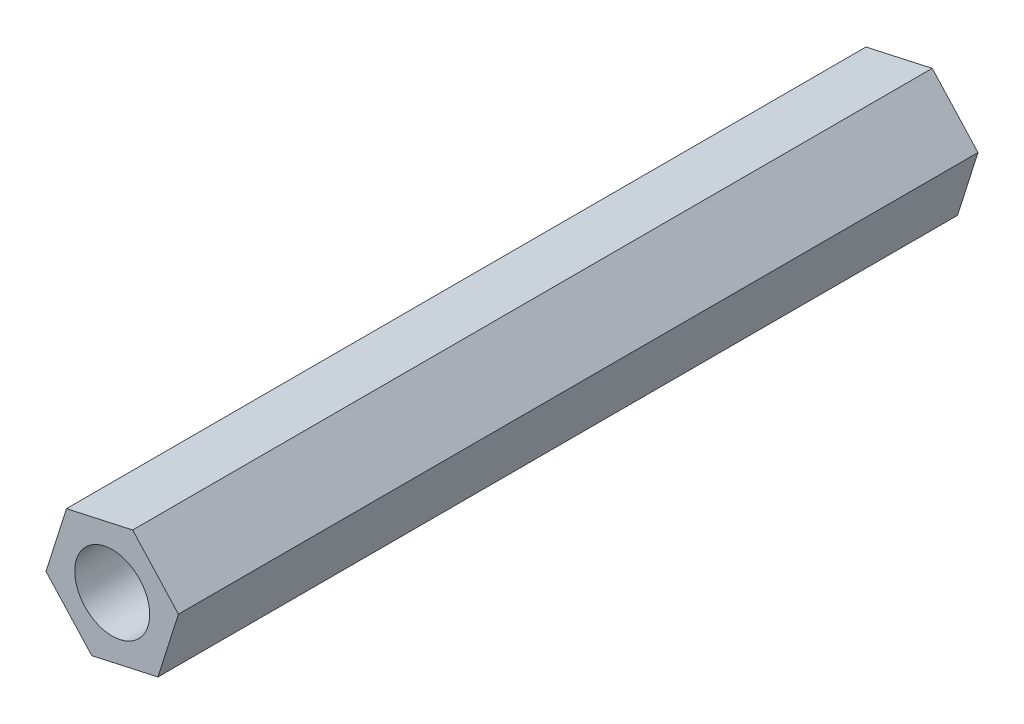
ISO-10303-21;
HEADER;
FILE_DESCRIPTION(('STEP AP214'),'2;1');
FILE_NAME('part.step','',(''),(''),'','','');
FILE_SCHEMA(('AUTOMOTIVE_DESIGN { 1 0 10303 214 1 1 1 1 }'));
ENDSEC;
DATA;
#1=APPLICATION_CONTEXT('core data for automotive mechanical design processes');
#2=APPLICATION_PROTOCOL_DEFINITION('international standard','automotive_design',2000,#1);
#3=PRODUCT_CONTEXT('',#1,'mechanical');
#4=PRODUCT('Part','Part','',(#3));
#5=PRODUCT_RELATED_PRODUCT_CATEGORY('part','',(#4));
#6=PRODUCT_DEFINITION_FORMATION('','',#4);
#7=PRODUCT_DEFINITION_CONTEXT('part definition',#1,'design');
#8=PRODUCT_DEFINITION('design','',#6,#7);
#9=PRODUCT_DEFINITION_SHAPE('','',#8);
#10=(LENGTH_UNIT() NAMED_UNIT(*) SI_UNIT(.MILLI.,.METRE.));
#11=(NAMED_UNIT(*) PLANE_ANGLE_UNIT() SI_UNIT($,.RADIAN.));
#12=(NAMED_UNIT(*) SI_UNIT($,.STERADIAN.) SOLID_ANGLE_UNIT());
#13=UNCERTAINTY_MEASURE_WITH_UNIT(LENGTH_MEASURE(1.E-05),#10,'distance_accuracy_value','');
#14=(GEOMETRIC_REPRESENTATION_CONTEXT(3) GLOBAL_UNCERTAINTY_ASSIGNED_CONTEXT((#13)) GLOBAL_UNIT_ASSIGNED_CONTEXT((#10,
#11,#12)) REPRESENTATION_CONTEXT('',''));
#15=CARTESIAN_POINT('',(0.,0.,0.));
#16=DIRECTION('',(0.,0.,1.));
#17=DIRECTION('',(1.,0.,0.));
#18=AXIS2_PLACEMENT_3D('',#15,#16,#17);
#19=CARTESIAN_POINT('',(0.,0.,32.));
#20=DIRECTION('',(0.,0.,1.));
#21=DIRECTION('',(1.,0.,0.));
#22=AXIS2_PLACEMENT_3D('',#19,#20,#21);
#23=PLANE('',#22);
#24=DIRECTION('',(0.301648882780597,0.953419084934436,0.));
#25=VECTOR('',#24,1.);
#26=CARTESIAN_POINT('',(1.83126574996171,-2.00244827307736,32.));
#27=LINE('',#26,#25);
#28=CARTESIAN_POINT('',(1.83126574996171,-2.00244827307736,32.));
#29=VERTEX_POINT('',#28);
#30=CARTESIAN_POINT('',(2.64980394923012,0.584698524008543,32.));
#31=VERTEX_POINT('',#30);
#32=EDGE_CURVE('E146',#29,#31,#27,.T.);
#33=ORIENTED_EDGE('',*,*,#32,.T.);
#34=DIRECTION('',(-0.674860706615837,0.737945137978409,0.));
#35=VECTOR('',#34,1.);
#36=CARTESIAN_POINT('',(2.64980394923012,0.584698524008543,32.));
#37=LINE('',#36,#35);
#38=CARTESIAN_POINT('',(0.818538199268401,2.58714679708588,32.));
#39=VERTEX_POINT('',#38);
#40=EDGE_CURVE('E94',#31,#39,#37,.T.);
#41=ORIENTED_EDGE('',*,*,#40,.T.);
#42=DIRECTION('',(-0.976509589396434,-0.215473946956026,0.));
#43=VECTOR('',#42,1.);
#44=CARTESIAN_POINT('',(0.818538199268401,2.58714679708588,32.));
#45=LINE('',#44,#43);
#46=CARTESIAN_POINT('',(-1.8312657499617,2.00244827307734,32.));
#47=VERTEX_POINT('',#46);
#48=EDGE_CURVE('E107',#39,#47,#45,.T.);
#49=ORIENTED_EDGE('',*,*,#48,.T.);
#50=DIRECTION('',(-0.301648882780597,-0.953419084934436,0.));
#51=VECTOR('',#50,1.);
#52=CARTESIAN_POINT('',(-1.8312657499617,2.00244827307734,32.));
#53=LINE('',#52,#51);
#54=CARTESIAN_POINT('',(-2.6498039492301,-0.584698524008529,32.));
#55=VERTEX_POINT('',#54);
#56=EDGE_CURVE('E101',#47,#55,#53,.T.);
#57=ORIENTED_EDGE('',*,*,#56,.T.);
#58=DIRECTION('',(0.674860706615837,-0.737945137978409,0.));
#59=VECTOR('',#58,1.);
#60=CARTESIAN_POINT('',(-2.6498039492301,-0.584698524008529,32.));
#61=LINE('',#60,#59);
#62=CARTESIAN_POINT('',(-0.818538199268357,-2.58714679708589,32.));
#63=VERTEX_POINT('',#62);
#64=EDGE_CURVE('E105',#55,#63,#61,.T.);
#65=ORIENTED_EDGE('',*,*,#64,.T.);
#66=DIRECTION('',(0.976509589396434,0.215473946956027,0.));
#67=VECTOR('',#66,1.);
#68=CARTESIAN_POINT('',(-0.818538199268357,-2.58714679708589,32.));
#69=LINE('',#68,#67);
#70=EDGE_CURVE('E57',#63,#29,#69,.T.);
#71=ORIENTED_EDGE('',*,*,#70,.T.);
#72=EDGE_LOOP('',(#33,#41,#49,#57,#65,#71));
#73=FACE_BOUND('',#72,.T.);
#74=CARTESIAN_POINT('',(0.,0.,32.));
#75=DIRECTION('',(0.,0.,1.));
#76=DIRECTION('',(1.,0.,0.));
#77=AXIS2_PLACEMENT_3D('',#74,#75,#76);
#78=CIRCLE('',#77,1.5);
#79=CARTESIAN_POINT('',(1.5,0.,32.));
#80=VERTEX_POINT('',#79);
#81=EDGE_CURVE('E134',#80,#80,#78,.T.);
#82=ORIENTED_EDGE('',*,*,#81,.F.);
#83=EDGE_LOOP('',(#82));
#84=FACE_BOUND('',#83,.T.);
#85=ADVANCED_FACE('F39',(#73,#84),#23,.T.);
#86=CARTESIAN_POINT('',(0.,0.,0.));
#87=DIRECTION('',(0.,0.,1.));
#88=DIRECTION('',(1.,0.,0.));
#89=AXIS2_PLACEMENT_3D('',#86,#87,#88);
#90=PLANE('',#89);
#91=DIRECTION('',(0.301648882780597,0.953419084934436,0.));
#92=VECTOR('',#91,1.);
#93=CARTESIAN_POINT('',(1.83126574996171,-2.00244827307736,0.));
#94=LINE('',#93,#92);
#95=CARTESIAN_POINT('',(1.83126574996171,-2.00244827307736,0.));
#96=VERTEX_POINT('',#95);
#97=CARTESIAN_POINT('',(2.64980394923012,0.584698524008543,0.));
#98=VERTEX_POINT('',#97);
#99=EDGE_CURVE('E129',#96,#98,#94,.T.);
#100=ORIENTED_EDGE('',*,*,#99,.F.);
#101=DIRECTION('',(0.976509589396434,0.215473946956027,0.));
#102=VECTOR('',#101,1.);
#103=CARTESIAN_POINT('',(-0.818538199268357,-2.58714679708589,0.));
#104=LINE('',#103,#102);
#105=CARTESIAN_POINT('',(-0.818538199268357,-2.58714679708589,0.));
#106=VERTEX_POINT('',#105);
#107=EDGE_CURVE('E86',#106,#96,#104,.T.);
#108=ORIENTED_EDGE('',*,*,#107,.F.);
#109=DIRECTION('',(0.674860706615837,-0.737945137978409,0.));
#110=VECTOR('',#109,1.);
#111=CARTESIAN_POINT('',(-2.6498039492301,-0.584698524008529,0.));
#112=LINE('',#111,#110);
#113=CARTESIAN_POINT('',(-2.6498039492301,-0.584698524008529,0.));
#114=VERTEX_POINT('',#113);
#115=EDGE_CURVE('E80',#114,#106,#112,.T.);
#116=ORIENTED_EDGE('',*,*,#115,.F.);
#117=DIRECTION('',(-0.301648882780597,-0.953419084934436,0.));
#118=VECTOR('',#117,1.);
#119=CARTESIAN_POINT('',(-1.8312657499617,2.00244827307734,0.));
#120=LINE('',#119,#118);
#121=CARTESIAN_POINT('',(-1.8312657499617,2.00244827307734,0.));
#122=VERTEX_POINT('',#121);
#123=EDGE_CURVE('E116',#122,#114,#120,.T.);
#124=ORIENTED_EDGE('',*,*,#123,.F.);
#125=DIRECTION('',(-0.976509589396434,-0.215473946956026,0.));
#126=VECTOR('',#125,1.);
#127=CARTESIAN_POINT('',(0.818538199268401,2.58714679708588,0.));
#128=LINE('',#127,#126);
#129=CARTESIAN_POINT('',(0.818538199268401,2.58714679708588,0.));
#130=VERTEX_POINT('',#129);
#131=EDGE_CURVE('E137',#130,#122,#128,.T.);
#132=ORIENTED_EDGE('',*,*,#131,.F.);
#133=DIRECTION('',(-0.674860706615837,0.737945137978409,0.));
#134=VECTOR('',#133,1.);
#135=CARTESIAN_POINT('',(2.64980394923012,0.584698524008543,0.));
#136=LINE('',#135,#134);
#137=EDGE_CURVE('E133',#98,#130,#136,.T.);
#138=ORIENTED_EDGE('',*,*,#137,.F.);
#139=EDGE_LOOP('',(#100,#108,#116,#124,#132,#138));
#140=FACE_BOUND('',#139,.T.);
#141=CARTESIAN_POINT('',(0.,0.,0.));
#142=DIRECTION('',(0.,0.,1.));
#143=DIRECTION('',(1.,0.,0.));
#144=AXIS2_PLACEMENT_3D('',#141,#142,#143);
#145=CIRCLE('',#144,1.5);
#146=CARTESIAN_POINT('',(1.5,0.,0.));
#147=VERTEX_POINT('',#146);
#148=EDGE_CURVE('E243',#147,#147,#145,.T.);
#149=ORIENTED_EDGE('',*,*,#148,.T.);
#150=EDGE_LOOP('',(#149));
#151=FACE_BOUND('',#150,.T.);
#152=ADVANCED_FACE('F159',(#140,#151),#90,.F.);
#153=CARTESIAN_POINT('',(1.83126574996171,-2.00244827307736,32.));
#154=DIRECTION('',(-0.953419084934436,0.301648882780597,0.));
#155=DIRECTION('',(-0.301648882780597,-0.953419084934436,0.));
#156=AXIS2_PLACEMENT_3D('',#153,#154,#155);
#157=PLANE('',#156);
#158=ORIENTED_EDGE('',*,*,#99,.T.);
#159=DIRECTION('',(0.,0.,-1.));
#160=VECTOR('',#159,1.);
#161=CARTESIAN_POINT('',(2.64980394923012,0.584698524008543,32.));
#162=LINE('',#161,#160);
#163=EDGE_CURVE('E11',#31,#98,#162,.T.);
#164=ORIENTED_EDGE('',*,*,#163,.F.);
#165=ORIENTED_EDGE('',*,*,#32,.F.);
#166=DIRECTION('',(0.,0.,-1.));
#167=VECTOR('',#166,1.);
#168=CARTESIAN_POINT('',(1.83126574996171,-2.00244827307736,32.));
#169=LINE('',#168,#167);
#170=EDGE_CURVE('E125',#29,#96,#169,.T.);
#171=ORIENTED_EDGE('',*,*,#170,.T.);
#172=EDGE_LOOP('',(#158,#164,#165,#171));
#173=FACE_BOUND('',#172,.T.);
#174=ADVANCED_FACE('F41',(#173),#157,.F.);
#175=CARTESIAN_POINT('',(2.64980394923012,0.584698524008543,32.));
#176=DIRECTION('',(-0.737945137978409,-0.674860706615837,0.));
#177=DIRECTION('',(0.674860706615837,-0.737945137978409,0.));
#178=AXIS2_PLACEMENT_3D('',#175,#176,#177);
#179=PLANE('',#178);
#180=ORIENTED_EDGE('',*,*,#137,.T.);
#181=DIRECTION('',(0.,0.,-1.));
#182=VECTOR('',#181,1.);
#183=CARTESIAN_POINT('',(0.818538199268401,2.58714679708588,32.));
#184=LINE('',#183,#182);
#185=EDGE_CURVE('E49',#39,#130,#184,.T.);
#186=ORIENTED_EDGE('',*,*,#185,.F.);
#187=ORIENTED_EDGE('',*,*,#40,.F.);
#188=ORIENTED_EDGE('',*,*,#163,.T.);
#189=EDGE_LOOP('',(#180,#186,#187,#188));
#190=FACE_BOUND('',#189,.T.);
#191=ADVANCED_FACE('F184',(#190),#179,.F.);
#192=CARTESIAN_POINT('',(0.818538199268401,2.58714679708588,32.));
#193=DIRECTION('',(0.215473946956026,-0.976509589396434,0.));
#194=DIRECTION('',(0.976509589396434,0.215473946956026,0.));
#195=AXIS2_PLACEMENT_3D('',#192,#193,#194);
#196=PLANE('',#195);
#197=ORIENTED_EDGE('',*,*,#131,.T.);
#198=DIRECTION('',(0.,0.,-1.));
#199=VECTOR('',#198,1.);
#200=CARTESIAN_POINT('',(-1.8312657499617,2.00244827307734,32.));
#201=LINE('',#200,#199);
#202=EDGE_CURVE('E118',#47,#122,#201,.T.);
#203=ORIENTED_EDGE('',*,*,#202,.F.);
#204=ORIENTED_EDGE('',*,*,#48,.F.);
#205=ORIENTED_EDGE('',*,*,#185,.T.);
#206=EDGE_LOOP('',(#197,#203,#204,#205));
#207=FACE_BOUND('',#206,.T.);
#208=ADVANCED_FACE('F156',(#207),#196,.F.);
#209=CARTESIAN_POINT('',(-1.8312657499617,2.00244827307734,32.));
#210=DIRECTION('',(0.953419084934436,-0.301648882780597,0.));
#211=DIRECTION('',(0.301648882780597,0.953419084934436,0.));
#212=AXIS2_PLACEMENT_3D('',#209,#210,#211);
#213=PLANE('',#212);
#214=ORIENTED_EDGE('',*,*,#123,.T.);
#215=DIRECTION('',(0.,0.,-1.));
#216=VECTOR('',#215,1.);
#217=CARTESIAN_POINT('',(-2.6498039492301,-0.584698524008529,32.));
#218=LINE('',#217,#216);
#219=EDGE_CURVE('E113',#55,#114,#218,.T.);
#220=ORIENTED_EDGE('',*,*,#219,.F.);
#221=ORIENTED_EDGE('',*,*,#56,.F.);
#222=ORIENTED_EDGE('',*,*,#202,.T.);
#223=EDGE_LOOP('',(#214,#220,#221,#222));
#224=FACE_BOUND('',#223,.T.);
#225=ADVANCED_FACE('F114',(#224),#213,.F.);
#226=CARTESIAN_POINT('',(-2.6498039492301,-0.584698524008529,32.));
#227=DIRECTION('',(0.737945137978409,0.674860706615837,0.));
#228=DIRECTION('',(-0.674860706615837,0.737945137978409,0.));
#229=AXIS2_PLACEMENT_3D('',#226,#227,#228);
#230=PLANE('',#229);
#231=ORIENTED_EDGE('',*,*,#115,.T.);
#232=DIRECTION('',(0.,0.,-1.));
#233=VECTOR('',#232,1.);
#234=CARTESIAN_POINT('',(-0.818538199268357,-2.58714679708589,32.));
#235=LINE('',#234,#233);
#236=EDGE_CURVE('E119',#63,#106,#235,.T.);
#237=ORIENTED_EDGE('',*,*,#236,.F.);
#238=ORIENTED_EDGE('',*,*,#64,.F.);
#239=ORIENTED_EDGE('',*,*,#219,.T.);
#240=EDGE_LOOP('',(#231,#237,#238,#239));
#241=FACE_BOUND('',#240,.T.);
#242=ADVANCED_FACE('F121',(#241),#230,.F.);
#243=CARTESIAN_POINT('',(-0.818538199268357,-2.58714679708589,32.));
#244=DIRECTION('',(-0.215473946956027,0.976509589396434,0.));
#245=DIRECTION('',(-0.976509589396434,-0.215473946956027,0.));
#246=AXIS2_PLACEMENT_3D('',#243,#244,#245);
#247=PLANE('',#246);
#248=ORIENTED_EDGE('',*,*,#107,.T.);
#249=ORIENTED_EDGE('',*,*,#170,.F.);
#250=ORIENTED_EDGE('',*,*,#70,.F.);
#251=ORIENTED_EDGE('',*,*,#236,.T.);
#252=EDGE_LOOP('',(#248,#249,#250,#251));
#253=FACE_BOUND('',#252,.T.);
#254=ADVANCED_FACE('F164',(#253),#247,.F.);
#255=CARTESIAN_POINT('',(0.,0.,32.));
#256=DIRECTION('',(0.,0.,-1.));
#257=DIRECTION('',(-1.,0.,0.));
#258=AXIS2_PLACEMENT_3D('',#255,#256,#257);
#259=CYLINDRICAL_SURFACE('',#258,1.5);
#260=ORIENTED_EDGE('',*,*,#81,.T.);
#261=EDGE_LOOP('',(#260));
#262=FACE_BOUND('',#261,.T.);
#263=ORIENTED_EDGE('',*,*,#148,.F.);
#264=EDGE_LOOP('',(#263));
#265=FACE_BOUND('',#264,.T.);
#266=ADVANCED_FACE('F166',(#262,#265),#259,.F.);
#267=CLOSED_SHELL('',(#85,#152,#174,#191,#208,#225,#242,#254,#266));
#268=MANIFOLD_SOLID_BREP('B2',#267);
#269=ADVANCED_BREP_SHAPE_REPRESENTATION('',(#18,#268),#14);
#270=SHAPE_DEFINITION_REPRESENTATION(#9,#269);
ENDSEC;
END-ISO-10303-21;
